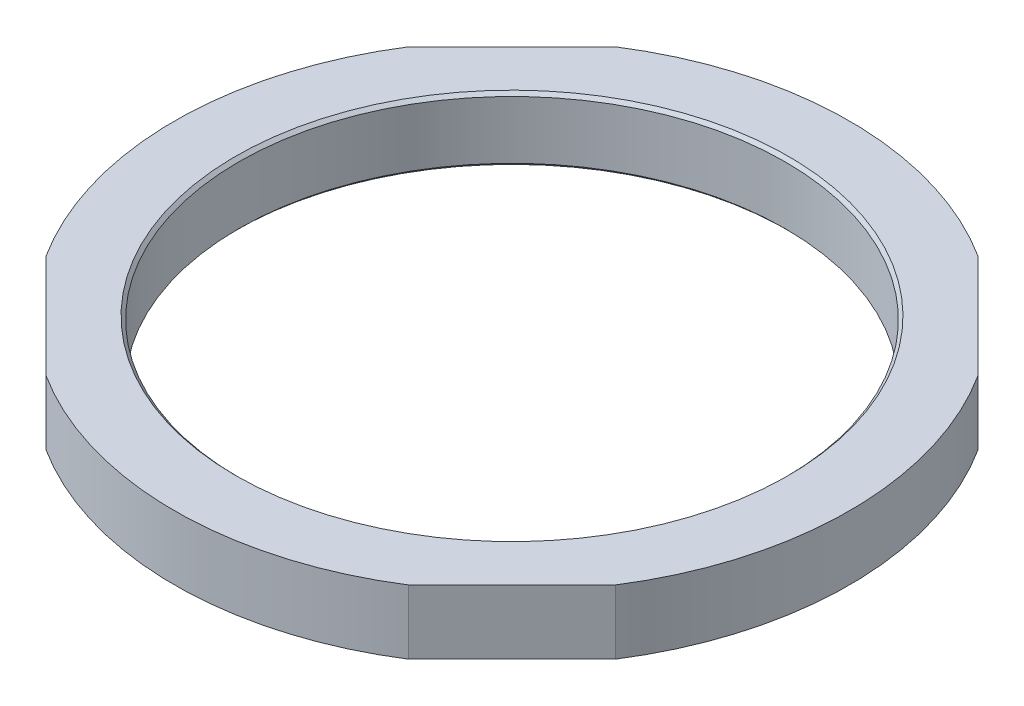
ISO-10303-21;
HEADER;
FILE_DESCRIPTION(('STEP AP214'),'2;1');
FILE_NAME('part.step','',(''),(''),'','','');
FILE_SCHEMA(('AUTOMOTIVE_DESIGN { 1 0 10303 214 1 1 1 1 }'));
ENDSEC;
DATA;
#1=APPLICATION_CONTEXT('core data for automotive mechanical design processes');
#2=APPLICATION_PROTOCOL_DEFINITION('international standard','automotive_design',2000,#1);
#3=PRODUCT_CONTEXT('',#1,'mechanical');
#4=PRODUCT('Part','Part','',(#3));
#5=PRODUCT_RELATED_PRODUCT_CATEGORY('part','',(#4));
#6=PRODUCT_DEFINITION_FORMATION('','',#4);
#7=PRODUCT_DEFINITION_CONTEXT('part definition',#1,'design');
#8=PRODUCT_DEFINITION('design','',#6,#7);
#9=PRODUCT_DEFINITION_SHAPE('','',#8);
#10=(LENGTH_UNIT() NAMED_UNIT(*) SI_UNIT(.MILLI.,.METRE.));
#11=(NAMED_UNIT(*) PLANE_ANGLE_UNIT() SI_UNIT($,.RADIAN.));
#12=(NAMED_UNIT(*) SI_UNIT($,.STERADIAN.) SOLID_ANGLE_UNIT());
#13=UNCERTAINTY_MEASURE_WITH_UNIT(LENGTH_MEASURE(1.E-05),#10,'distance_accuracy_value','');
#14=(GEOMETRIC_REPRESENTATION_CONTEXT(3) GLOBAL_UNCERTAINTY_ASSIGNED_CONTEXT((#13)) GLOBAL_UNIT_ASSIGNED_CONTEXT((#10,
#11,#12)) REPRESENTATION_CONTEXT('',''));
#15=CARTESIAN_POINT('',(0.,0.,0.));
#16=DIRECTION('',(0.,0.,1.));
#17=DIRECTION('',(1.,0.,0.));
#18=AXIS2_PLACEMENT_3D('',#15,#16,#17);
#19=CARTESIAN_POINT('',(0.,2.,0.));
#20=DIRECTION('',(0.,-1.,0.));
#21=DIRECTION('',(0.,0.,-1.));
#22=AXIS2_PLACEMENT_3D('',#19,#20,#21);
#23=CYLINDRICAL_SURFACE('',#22,21.);
#24=CARTESIAN_POINT('',(0.,2.,0.));
#25=DIRECTION('',(0.,1.,0.));
#26=DIRECTION('',(0.,0.,1.));
#27=AXIS2_PLACEMENT_3D('',#24,#25,#26);
#28=CIRCLE('',#27,21.);
#29=CARTESIAN_POINT('',(17.7167136960055,2.,11.274664332643));
#30=VERTEX_POINT('',#29);
#31=CARTESIAN_POINT('',(17.7167136960055,2.,-11.274664332643));
#32=VERTEX_POINT('',#31);
#33=EDGE_CURVE('E108',#30,#32,#28,.T.);
#34=ORIENTED_EDGE('',*,*,#33,.F.);
#35=DIRECTION('',(0.,1.,0.));
#36=VECTOR('',#35,1.);
#37=CARTESIAN_POINT('',(17.7167136960055,-2.,11.274664332643));
#38=LINE('',#37,#36);
#39=CARTESIAN_POINT('',(17.7167136960055,-2.,11.274664332643));
#40=VERTEX_POINT('',#39);
#41=EDGE_CURVE('E95',#40,#30,#38,.T.);
#42=ORIENTED_EDGE('',*,*,#41,.F.);
#43=CARTESIAN_POINT('',(0.,-2.,0.));
#44=DIRECTION('',(0.,1.,0.));
#45=DIRECTION('',(0.,0.,1.));
#46=AXIS2_PLACEMENT_3D('',#43,#44,#45);
#47=CIRCLE('',#46,21.);
#48=CARTESIAN_POINT('',(17.7167136960055,-2.,-11.274664332643));
#49=VERTEX_POINT('',#48);
#50=EDGE_CURVE('E124',#40,#49,#47,.T.);
#51=ORIENTED_EDGE('',*,*,#50,.T.);
#52=DIRECTION('',(0.,1.,0.));
#53=VECTOR('',#52,1.);
#54=CARTESIAN_POINT('',(17.7167136960055,-2.,-11.274664332643));
#55=LINE('',#54,#53);
#56=EDGE_CURVE('E116',#49,#32,#55,.T.);
#57=ORIENTED_EDGE('',*,*,#56,.T.);
#58=EDGE_LOOP('',(#34,#42,#51,#57));
#59=FACE_BOUND('',#58,.T.);
#60=ADVANCED_FACE('F32',(#59),#23,.T.);
#61=CARTESIAN_POINT('',(-11.2746643326429,-2.,17.7167136960055));
#62=VERTEX_POINT('',#61);
#63=CARTESIAN_POINT('',(11.2746643326429,-2.,17.7167136960055));
#64=VERTEX_POINT('',#63);
#65=EDGE_CURVE('E175',#62,#64,#47,.T.);
#66=ORIENTED_EDGE('',*,*,#65,.T.);
#67=DIRECTION('',(0.,1.,0.));
#68=VECTOR('',#67,1.);
#69=CARTESIAN_POINT('',(11.2746643326429,-2.,17.7167136960055));
#70=LINE('',#69,#68);
#71=CARTESIAN_POINT('',(11.2746643326429,2.,17.7167136960055));
#72=VERTEX_POINT('',#71);
#73=EDGE_CURVE('E102',#64,#72,#70,.T.);
#74=ORIENTED_EDGE('',*,*,#73,.T.);
#75=CARTESIAN_POINT('',(-11.2746643326429,2.,17.7167136960055));
#76=VERTEX_POINT('',#75);
#77=EDGE_CURVE('E111',#76,#72,#28,.T.);
#78=ORIENTED_EDGE('',*,*,#77,.F.);
#79=DIRECTION('',(0.,1.,0.));
#80=VECTOR('',#79,1.);
#81=CARTESIAN_POINT('',(-11.2746643326429,-2.,17.7167136960055));
#82=LINE('',#81,#80);
#83=EDGE_CURVE('E143',#62,#76,#82,.T.);
#84=ORIENTED_EDGE('',*,*,#83,.F.);
#85=EDGE_LOOP('',(#66,#74,#78,#84));
#86=FACE_BOUND('',#85,.T.);
#87=ADVANCED_FACE('F200',(#86),#23,.T.);
#88=CARTESIAN_POINT('',(-17.7167136960054,-2.,-11.2746643326431));
#89=VERTEX_POINT('',#88);
#90=CARTESIAN_POINT('',(-17.7167136960055,-2.,11.274664332643));
#91=VERTEX_POINT('',#90);
#92=EDGE_CURVE('E122',#89,#91,#47,.T.);
#93=ORIENTED_EDGE('',*,*,#92,.T.);
#94=DIRECTION('',(0.,1.,0.));
#95=VECTOR('',#94,1.);
#96=CARTESIAN_POINT('',(-17.7167136960055,-2.,11.274664332643));
#97=LINE('',#96,#95);
#98=CARTESIAN_POINT('',(-17.7167136960055,2.,11.274664332643));
#99=VERTEX_POINT('',#98);
#100=EDGE_CURVE('E112',#91,#99,#97,.T.);
#101=ORIENTED_EDGE('',*,*,#100,.T.);
#102=CARTESIAN_POINT('',(-17.7167136960054,2.,-11.2746643326431));
#103=VERTEX_POINT('',#102);
#104=EDGE_CURVE('E120',#103,#99,#28,.T.);
#105=ORIENTED_EDGE('',*,*,#104,.F.);
#106=DIRECTION('',(0.,1.,0.));
#107=VECTOR('',#106,1.);
#108=CARTESIAN_POINT('',(-17.7167136960054,-2.,-11.2746643326431));
#109=LINE('',#108,#107);
#110=EDGE_CURVE('E140',#89,#103,#109,.T.);
#111=ORIENTED_EDGE('',*,*,#110,.F.);
#112=EDGE_LOOP('',(#93,#101,#105,#111));
#113=FACE_BOUND('',#112,.T.);
#114=ADVANCED_FACE('F139',(#113),#23,.T.);
#115=CARTESIAN_POINT('',(0.,2.,0.));
#116=DIRECTION('',(0.,1.,0.));
#117=DIRECTION('',(0.,0.,1.));
#118=AXIS2_PLACEMENT_3D('',#115,#116,#117);
#119=PLANE('',#118);
#120=CARTESIAN_POINT('',(0.,2.,0.));
#121=DIRECTION('',(0.,1.,0.));
#122=DIRECTION('',(0.,0.,1.));
#123=AXIS2_PLACEMENT_3D('',#120,#121,#122);
#124=CIRCLE('',#123,17.2);
#125=CARTESIAN_POINT('',(0.,2.,17.2));
#126=VERTEX_POINT('',#125);
#127=EDGE_CURVE('E11',#126,#126,#124,.F.);
#128=ORIENTED_EDGE('',*,*,#127,.T.);
#129=EDGE_LOOP('',(#128));
#130=FACE_BOUND('',#129,.T.);
#131=DIRECTION('',(-0.707106781186548,0.,0.707106781186547));
#132=VECTOR('',#131,1.);
#133=CARTESIAN_POINT('',(17.7167136960055,2.,11.274664332643));
#134=LINE('',#133,#132);
#135=EDGE_CURVE('E47',#30,#72,#134,.T.);
#136=ORIENTED_EDGE('',*,*,#135,.F.);
#137=ORIENTED_EDGE('',*,*,#33,.T.);
#138=DIRECTION('',(0.70710678118655,0.,0.707106781186546));
#139=VECTOR('',#138,1.);
#140=CARTESIAN_POINT('',(11.2746643326429,2.,-17.7167136960055));
#141=LINE('',#140,#139);
#142=CARTESIAN_POINT('',(11.2746643326429,2.,-17.7167136960055));
#143=VERTEX_POINT('',#142);
#144=EDGE_CURVE('E158',#143,#32,#141,.T.);
#145=ORIENTED_EDGE('',*,*,#144,.F.);
#146=CARTESIAN_POINT('',(-11.2746643326428,2.,-17.7167136960056));
#147=VERTEX_POINT('',#146);
#148=EDGE_CURVE('E119',#143,#147,#28,.T.);
#149=ORIENTED_EDGE('',*,*,#148,.T.);
#150=DIRECTION('',(0.707106781186553,0.,-0.707106781186542));
#151=VECTOR('',#150,1.);
#152=CARTESIAN_POINT('',(-17.7167136960054,2.,-11.2746643326431));
#153=LINE('',#152,#151);
#154=EDGE_CURVE('E135',#103,#147,#153,.T.);
#155=ORIENTED_EDGE('',*,*,#154,.F.);
#156=ORIENTED_EDGE('',*,*,#104,.T.);
#157=DIRECTION('',(-0.70710678118655,0.,-0.707106781186546));
#158=VECTOR('',#157,1.);
#159=CARTESIAN_POINT('',(-11.2746643326429,2.,17.7167136960055));
#160=LINE('',#159,#158);
#161=EDGE_CURVE('E55',#76,#99,#160,.T.);
#162=ORIENTED_EDGE('',*,*,#161,.F.);
#163=ORIENTED_EDGE('',*,*,#77,.T.);
#164=EDGE_LOOP('',(#136,#137,#145,#149,#155,#156,#162,#163));
#165=FACE_BOUND('',#164,.T.);
#166=ADVANCED_FACE('F106',(#130,#165),#119,.T.);
#167=CARTESIAN_POINT('',(0.,-2.,0.));
#168=DIRECTION('',(0.,1.,0.));
#169=DIRECTION('',(0.,0.,1.));
#170=AXIS2_PLACEMENT_3D('',#167,#168,#169);
#171=PLANE('',#170);
#172=CARTESIAN_POINT('',(0.,-2.,0.));
#173=DIRECTION('',(0.,1.,0.));
#174=DIRECTION('',(0.,0.,1.));
#175=AXIS2_PLACEMENT_3D('',#172,#173,#174);
#176=CIRCLE('',#175,17.2);
#177=CARTESIAN_POINT('',(0.,-2.,17.2));
#178=VERTEX_POINT('',#177);
#179=EDGE_CURVE('E127',#178,#178,#176,.T.);
#180=ORIENTED_EDGE('',*,*,#179,.T.);
#181=EDGE_LOOP('',(#180));
#182=FACE_BOUND('',#181,.T.);
#183=ORIENTED_EDGE('',*,*,#50,.F.);
#184=DIRECTION('',(-0.707106781186548,0.,0.707106781186547));
#185=VECTOR('',#184,1.);
#186=CARTESIAN_POINT('',(17.7167136960055,-2.,11.274664332643));
#187=LINE('',#186,#185);
#188=EDGE_CURVE('E98',#40,#64,#187,.T.);
#189=ORIENTED_EDGE('',*,*,#188,.T.);
#190=ORIENTED_EDGE('',*,*,#65,.F.);
#191=DIRECTION('',(-0.70710678118655,0.,-0.707106781186546));
#192=VECTOR('',#191,1.);
#193=CARTESIAN_POINT('',(-11.2746643326429,-2.,17.7167136960055));
#194=LINE('',#193,#192);
#195=EDGE_CURVE('E145',#62,#91,#194,.T.);
#196=ORIENTED_EDGE('',*,*,#195,.T.);
#197=ORIENTED_EDGE('',*,*,#92,.F.);
#198=DIRECTION('',(0.707106781186553,0.,-0.707106781186542));
#199=VECTOR('',#198,1.);
#200=CARTESIAN_POINT('',(-17.7167136960054,-2.,-11.2746643326431));
#201=LINE('',#200,#199);
#202=CARTESIAN_POINT('',(-11.2746643326428,-2.,-17.7167136960056));
#203=VERTEX_POINT('',#202);
#204=EDGE_CURVE('E151',#89,#203,#201,.T.);
#205=ORIENTED_EDGE('',*,*,#204,.T.);
#206=CARTESIAN_POINT('',(11.2746643326429,-2.,-17.7167136960055));
#207=VERTEX_POINT('',#206);
#208=EDGE_CURVE('E117',#207,#203,#47,.T.);
#209=ORIENTED_EDGE('',*,*,#208,.F.);
#210=DIRECTION('',(0.70710678118655,0.,0.707106781186546));
#211=VECTOR('',#210,1.);
#212=CARTESIAN_POINT('',(11.2746643326429,-2.,-17.7167136960055));
#213=LINE('',#212,#211);
#214=EDGE_CURVE('E160',#207,#49,#213,.T.);
#215=ORIENTED_EDGE('',*,*,#214,.T.);
#216=EDGE_LOOP('',(#183,#189,#190,#196,#197,#205,#209,#215));
#217=FACE_BOUND('',#216,.T.);
#218=ADVANCED_FACE('F173',(#182,#217),#171,.F.);
#219=ORIENTED_EDGE('',*,*,#208,.T.);
#220=DIRECTION('',(0.,1.,0.));
#221=VECTOR('',#220,1.);
#222=CARTESIAN_POINT('',(-11.2746643326428,-2.,-17.7167136960056));
#223=LINE('',#222,#221);
#224=EDGE_CURVE('E154',#203,#147,#223,.T.);
#225=ORIENTED_EDGE('',*,*,#224,.T.);
#226=ORIENTED_EDGE('',*,*,#148,.F.);
#227=DIRECTION('',(0.,1.,0.));
#228=VECTOR('',#227,1.);
#229=CARTESIAN_POINT('',(11.2746643326429,-2.,-17.7167136960055));
#230=LINE('',#229,#228);
#231=EDGE_CURVE('E163',#207,#143,#230,.T.);
#232=ORIENTED_EDGE('',*,*,#231,.F.);
#233=EDGE_LOOP('',(#219,#225,#226,#232));
#234=FACE_BOUND('',#233,.T.);
#235=ADVANCED_FACE('F169',(#234),#23,.T.);
#236=CARTESIAN_POINT('',(0.,2.,0.));
#237=DIRECTION('',(0.,-1.,0.));
#238=DIRECTION('',(0.,0.,-1.));
#239=AXIS2_PLACEMENT_3D('',#236,#237,#238);
#240=CYLINDRICAL_SURFACE('',#239,17.);
#241=CARTESIAN_POINT('',(0.,-1.8,0.));
#242=DIRECTION('',(0.,1.,0.));
#243=DIRECTION('',(0.,0.,1.));
#244=AXIS2_PLACEMENT_3D('',#241,#242,#243);
#245=CIRCLE('',#244,17.);
#246=CARTESIAN_POINT('',(0.,-1.8,17.));
#247=VERTEX_POINT('',#246);
#248=EDGE_CURVE('E40',#247,#247,#245,.F.);
#249=ORIENTED_EDGE('',*,*,#248,.T.);
#250=EDGE_LOOP('',(#249));
#251=FACE_BOUND('',#250,.T.);
#252=CARTESIAN_POINT('',(0.,1.80000000000002,0.));
#253=DIRECTION('',(0.,1.,0.));
#254=DIRECTION('',(0.,0.,1.));
#255=AXIS2_PLACEMENT_3D('',#252,#253,#254);
#256=CIRCLE('',#255,17.);
#257=CARTESIAN_POINT('',(0.,1.80000000000002,17.));
#258=VERTEX_POINT('',#257);
#259=EDGE_CURVE('E131',#258,#258,#256,.T.);
#260=ORIENTED_EDGE('',*,*,#259,.T.);
#261=EDGE_LOOP('',(#260));
#262=FACE_BOUND('',#261,.T.);
#263=ADVANCED_FACE('F182',(#251,#262),#240,.F.);
#264=CARTESIAN_POINT('',(11.2746643326429,-2.,-17.7167136960055));
#265=DIRECTION('',(-0.707106781186546,0.,0.70710678118655));
#266=DIRECTION('',(0.70710678118655,0.,0.707106781186546));
#267=AXIS2_PLACEMENT_3D('',#264,#265,#266);
#268=PLANE('',#267);
#269=ORIENTED_EDGE('',*,*,#56,.F.);
#270=ORIENTED_EDGE('',*,*,#214,.F.);
#271=ORIENTED_EDGE('',*,*,#231,.T.);
#272=ORIENTED_EDGE('',*,*,#144,.T.);
#273=EDGE_LOOP('',(#269,#270,#271,#272));
#274=FACE_BOUND('',#273,.T.);
#275=ADVANCED_FACE('F166',(#274),#268,.F.);
#276=CARTESIAN_POINT('',(-17.7167136960054,-2.,-11.2746643326431));
#277=DIRECTION('',(0.707106781186542,0.,0.707106781186553));
#278=DIRECTION('',(0.707106781186553,0.,-0.707106781186542));
#279=AXIS2_PLACEMENT_3D('',#276,#277,#278);
#280=PLANE('',#279);
#281=ORIENTED_EDGE('',*,*,#224,.F.);
#282=ORIENTED_EDGE('',*,*,#204,.F.);
#283=ORIENTED_EDGE('',*,*,#110,.T.);
#284=ORIENTED_EDGE('',*,*,#154,.T.);
#285=EDGE_LOOP('',(#281,#282,#283,#284));
#286=FACE_BOUND('',#285,.T.);
#287=ADVANCED_FACE('F171',(#286),#280,.F.);
#288=CARTESIAN_POINT('',(-11.2746643326429,-2.,17.7167136960055));
#289=DIRECTION('',(0.707106781186546,0.,-0.70710678118655));
#290=DIRECTION('',(-0.70710678118655,0.,-0.707106781186546));
#291=AXIS2_PLACEMENT_3D('',#288,#289,#290);
#292=PLANE('',#291);
#293=ORIENTED_EDGE('',*,*,#100,.F.);
#294=ORIENTED_EDGE('',*,*,#195,.F.);
#295=ORIENTED_EDGE('',*,*,#83,.T.);
#296=ORIENTED_EDGE('',*,*,#161,.T.);
#297=EDGE_LOOP('',(#293,#294,#295,#296));
#298=FACE_BOUND('',#297,.T.);
#299=ADVANCED_FACE('F211',(#298),#292,.F.);
#300=CARTESIAN_POINT('',(17.7167136960055,-2.,11.274664332643));
#301=DIRECTION('',(-0.707106781186547,0.,-0.707106781186548));
#302=DIRECTION('',(-0.707106781186548,0.,0.707106781186547));
#303=AXIS2_PLACEMENT_3D('',#300,#301,#302);
#304=PLANE('',#303);
#305=ORIENTED_EDGE('',*,*,#73,.F.);
#306=ORIENTED_EDGE('',*,*,#188,.F.);
#307=ORIENTED_EDGE('',*,*,#41,.T.);
#308=ORIENTED_EDGE('',*,*,#135,.T.);
#309=EDGE_LOOP('',(#305,#306,#307,#308));
#310=FACE_BOUND('',#309,.T.);
#311=ADVANCED_FACE('F96',(#310),#304,.F.);
#312=CARTESIAN_POINT('',(0.,-2.,0.));
#313=DIRECTION('',(0.,-1.,0.));
#314=DIRECTION('',(0.,0.,-1.));
#315=AXIS2_PLACEMENT_3D('',#312,#313,#314);
#316=CONICAL_SURFACE('',#315,17.2,0.785398163397448);
#317=ORIENTED_EDGE('',*,*,#248,.F.);
#318=EDGE_LOOP('',(#317));
#319=FACE_BOUND('',#318,.T.);
#320=ORIENTED_EDGE('',*,*,#179,.F.);
#321=EDGE_LOOP('',(#320));
#322=FACE_BOUND('',#321,.T.);
#323=ADVANCED_FACE('F185',(#319,#322),#316,.F.);
#324=CARTESIAN_POINT('',(0.,1.80000000000002,0.));
#325=DIRECTION('',(0.,1.,0.));
#326=DIRECTION('',(0.,0.,1.));
#327=AXIS2_PLACEMENT_3D('',#324,#325,#326);
#328=CONICAL_SURFACE('',#327,17.,0.785398163397448);
#329=CARTESIAN_POINT('',(0.,2.,17.2));
#330=CARTESIAN_POINT('',(0.,1.99791666666666,17.1979166666666));
#331=CARTESIAN_POINT('',(0.,1.99583333333333,17.1958333333333));
#332=CARTESIAN_POINT('',(0.,1.99166666666667,17.1916666666666));
#333=CARTESIAN_POINT('',(0.,1.98958333333333,17.1895833333333));
#334=CARTESIAN_POINT('',(0.,1.98541666666667,17.1854166666666));
#335=CARTESIAN_POINT('',(0.,1.98333333333333,17.1833333333333));
#336=CARTESIAN_POINT('',(0.,1.97916666666667,17.1791666666666));
#337=CARTESIAN_POINT('',(0.,1.97708333333333,17.1770833333333));
#338=CARTESIAN_POINT('',(0.,1.97291666666667,17.1729166666666));
#339=CARTESIAN_POINT('',(0.,1.97083333333333,17.1708333333333));
#340=CARTESIAN_POINT('',(0.,1.96666666666667,17.1666666666667));
#341=CARTESIAN_POINT('',(0.,1.96458333333334,17.1645833333333));
#342=CARTESIAN_POINT('',(0.,1.96041666666667,17.1604166666666));
#343=CARTESIAN_POINT('',(0.,1.95833333333334,17.1583333333333));
#344=CARTESIAN_POINT('',(0.,1.95416666666667,17.1541666666667));
#345=CARTESIAN_POINT('',(0.,1.95208333333334,17.1520833333333));
#346=CARTESIAN_POINT('',(0.,1.94791666666667,17.1479166666667));
#347=CARTESIAN_POINT('',(0.,1.94583333333334,17.1458333333333));
#348=CARTESIAN_POINT('',(0.,1.94166666666667,17.1416666666667));
#349=CARTESIAN_POINT('',(0.,1.93958333333334,17.1395833333333));
#350=CARTESIAN_POINT('',(0.,1.93541666666667,17.1354166666667));
#351=CARTESIAN_POINT('',(0.,1.93333333333334,17.1333333333333));
#352=CARTESIAN_POINT('',(0.,1.92916666666667,17.1291666666667));
#353=CARTESIAN_POINT('',(0.,1.92708333333334,17.1270833333333));
#354=CARTESIAN_POINT('',(0.,1.92291666666667,17.1229166666667));
#355=CARTESIAN_POINT('',(0.,1.92083333333334,17.1208333333333));
#356=CARTESIAN_POINT('',(0.,1.91666666666667,17.1166666666667));
#357=CARTESIAN_POINT('',(0.,1.91458333333334,17.1145833333333));
#358=CARTESIAN_POINT('',(0.,1.91041666666667,17.1104166666667));
#359=CARTESIAN_POINT('',(0.,1.90833333333334,17.1083333333333));
#360=CARTESIAN_POINT('',(0.,1.90416666666668,17.1041666666667));
#361=CARTESIAN_POINT('',(0.,1.90208333333334,17.1020833333333));
#362=CARTESIAN_POINT('',(0.,1.89791666666668,17.0979166666667));
#363=CARTESIAN_POINT('',(0.,1.89583333333334,17.0958333333333));
#364=CARTESIAN_POINT('',(0.,1.89166666666668,17.0916666666667));
#365=CARTESIAN_POINT('',(0.,1.88958333333334,17.0895833333333));
#366=CARTESIAN_POINT('',(0.,1.88541666666668,17.0854166666667));
#367=CARTESIAN_POINT('',(0.,1.88333333333334,17.0833333333333));
#368=CARTESIAN_POINT('',(0.,1.87916666666668,17.0791666666667));
#369=CARTESIAN_POINT('',(0.,1.87708333333334,17.0770833333333));
#370=CARTESIAN_POINT('',(0.,1.87291666666668,17.0729166666667));
#371=CARTESIAN_POINT('',(0.,1.87083333333335,17.0708333333333));
#372=CARTESIAN_POINT('',(0.,1.86666666666668,17.0666666666667));
#373=CARTESIAN_POINT('',(0.,1.86458333333335,17.0645833333333));
#374=CARTESIAN_POINT('',(0.,1.86041666666668,17.0604166666667));
#375=CARTESIAN_POINT('',(0.,1.85833333333335,17.0583333333333));
#376=CARTESIAN_POINT('',(0.,1.85416666666668,17.0541666666667));
#377=CARTESIAN_POINT('',(0.,1.85208333333335,17.0520833333333));
#378=CARTESIAN_POINT('',(0.,1.84791666666668,17.0479166666667));
#379=CARTESIAN_POINT('',(0.,1.84583333333335,17.0458333333333));
#380=CARTESIAN_POINT('',(0.,1.84166666666668,17.0416666666667));
#381=CARTESIAN_POINT('',(0.,1.83958333333335,17.0395833333333));
#382=CARTESIAN_POINT('',(0.,1.83541666666668,17.0354166666667));
#383=CARTESIAN_POINT('',(0.,1.83333333333335,17.0333333333333));
#384=CARTESIAN_POINT('',(0.,1.82916666666668,17.0291666666667));
#385=CARTESIAN_POINT('',(0.,1.82708333333335,17.0270833333333));
#386=CARTESIAN_POINT('',(0.,1.82291666666668,17.0229166666667));
#387=CARTESIAN_POINT('',(0.,1.82083333333335,17.0208333333333));
#388=CARTESIAN_POINT('',(0.,1.81666666666668,17.0166666666667));
#389=CARTESIAN_POINT('',(0.,1.81458333333335,17.0145833333333));
#390=CARTESIAN_POINT('',(0.,1.81041666666669,17.0104166666667));
#391=CARTESIAN_POINT('',(0.,1.80833333333335,17.0083333333333));
#392=CARTESIAN_POINT('',(0.,1.80416666666669,17.0041666666667));
#393=CARTESIAN_POINT('',(0.,1.80208333333335,17.0020833333333));
#394=CARTESIAN_POINT('',(0.,1.80000000000002,17.));
#395=B_SPLINE_CURVE_WITH_KNOTS('',3,(#329,#330,#331,#332,#333,#334,#335,#336,#337,#338,#339,
#340,#341,#342,#343,#344,#345,#346,#347,#348,#349,#350,#351,#352,#353,#354,#355,#356,#357,#358,
#359,#360,#361,#362,#363,#364,#365,#366,#367,#368,#369,#370,#371,#372,#373,#374,#375,#376,#377,
#378,#379,#380,#381,#382,#383,#384,#385,#386,#387,#388,#389,#390,#391,#392,#393,#394),
.UNSPECIFIED.,.F.,.F.,(4,2,2,2,2,2,2,2,2,2,2,2,2,2,2,2,2,2,2,2,2,2,2,2,2,2,2,2,2,2,2,2,4),(0.,
0.00883883476483087,0.0176776695296617,0.0265165042944926,0.0353553390593235,0.0441941738241543,
0.0530330085889849,0.0618718433538158,0.0707106781186468,0.0795495128834777,0.0883883476483086,
0.0972271824131394,0.10606601717797,0.114904851942801,0.123743686707632,0.132582521472463,
0.141421356237294,0.150260191002125,0.159099025766956,0.167937860531786,0.176776695296617,
0.185615530061448,0.194454364826279,0.20329319959111,0.212132034355941,0.220970869120772,
0.229809703885603,0.238648538650433,0.247487373415264,0.256326208180095,0.265165042944926,
0.274003877709757,0.282842712474588),.UNSPECIFIED.);
#396=EDGE_CURVE('BSEAM34',#126,#258,#395,.T.);
#397=ORIENTED_EDGE('',*,*,#127,.F.);
#398=ORIENTED_EDGE('',*,*,#259,.F.);
#399=ORIENTED_EDGE('',*,*,#396,.T.);
#400=ORIENTED_EDGE('',*,*,#396,.F.);
#401=EDGE_LOOP('',(#397,#399,#398,#400));
#402=FACE_BOUND('',#401,.T.);
#403=ADVANCED_FACE('F34',(#402),#328,.F.);
#404=CLOSED_SHELL('',(#60,#87,#114,#166,#218,#235,#263,#275,#287,#299,#311,#323,#403));
#405=MANIFOLD_SOLID_BREP('B2',#404);
#406=ADVANCED_BREP_SHAPE_REPRESENTATION('',(#18,#405),#14);
#407=SHAPE_DEFINITION_REPRESENTATION(#9,#406);
ENDSEC;
END-ISO-10303-21;
